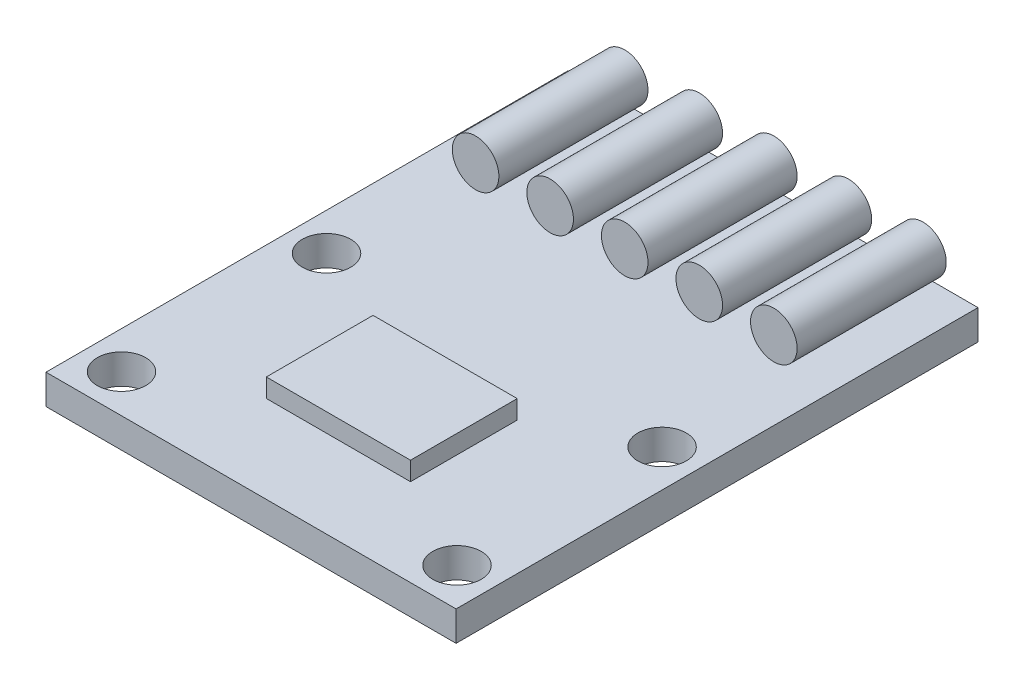
ISO-10303-21;
HEADER;
FILE_DESCRIPTION(('STEP AP214'),'2;1');
FILE_NAME('part.step','',(''),(''),'','','');
FILE_SCHEMA(('AUTOMOTIVE_DESIGN { 1 0 10303 214 1 1 1 1 }'));
ENDSEC;
DATA;
#1=APPLICATION_CONTEXT('core data for automotive mechanical design processes');
#2=APPLICATION_PROTOCOL_DEFINITION('international standard','automotive_design',2000,#1);
#3=PRODUCT_CONTEXT('',#1,'mechanical');
#4=PRODUCT('Part','Part','',(#3));
#5=PRODUCT_RELATED_PRODUCT_CATEGORY('part','',(#4));
#6=PRODUCT_DEFINITION_FORMATION('','',#4);
#7=PRODUCT_DEFINITION_CONTEXT('part definition',#1,'design');
#8=PRODUCT_DEFINITION('design','',#6,#7);
#9=PRODUCT_DEFINITION_SHAPE('','',#8);
#10=(LENGTH_UNIT() NAMED_UNIT(*) SI_UNIT(.MILLI.,.METRE.));
#11=(NAMED_UNIT(*) PLANE_ANGLE_UNIT() SI_UNIT($,.RADIAN.));
#12=(NAMED_UNIT(*) SI_UNIT($,.STERADIAN.) SOLID_ANGLE_UNIT());
#13=UNCERTAINTY_MEASURE_WITH_UNIT(LENGTH_MEASURE(1.E-05),#10,'distance_accuracy_value','');
#14=(GEOMETRIC_REPRESENTATION_CONTEXT(3) GLOBAL_UNCERTAINTY_ASSIGNED_CONTEXT((#13)) GLOBAL_UNIT_ASSIGNED_CONTEXT((#10,
#11,#12)) REPRESENTATION_CONTEXT('',''));
#15=CARTESIAN_POINT('',(0.,0.,0.));
#16=DIRECTION('',(0.,0.,1.));
#17=DIRECTION('',(1.,0.,0.));
#18=AXIS2_PLACEMENT_3D('',#15,#16,#17);
#19=CARTESIAN_POINT('',(8.0467094922053,2.84999999999989,-6.));
#20=DIRECTION('',(0.,0.,-1.));
#21=DIRECTION('',(-1.,0.,0.));
#22=AXIS2_PLACEMENT_3D('',#19,#20,#21);
#23=CYLINDRICAL_SURFACE('',#22,1.25);
#24=CARTESIAN_POINT('',(8.0467094922053,2.84999999999989,-6.));
#25=DIRECTION('',(0.,0.,-1.));
#26=DIRECTION('',(-1.,0.,0.));
#27=AXIS2_PLACEMENT_3D('',#24,#25,#26);
#28=CIRCLE('',#27,1.25);
#29=CARTESIAN_POINT('',(6.7967094922053,2.84999999999989,-6.));
#30=VERTEX_POINT('',#29);
#31=EDGE_CURVE('E11',#30,#30,#28,.T.);
#32=ORIENTED_EDGE('',*,*,#31,.T.);
#33=EDGE_LOOP('',(#32));
#34=FACE_BOUND('',#33,.T.);
#35=CARTESIAN_POINT('',(8.0467094922053,2.84999999999989,-14.));
#36=DIRECTION('',(0.,0.,-1.));
#37=DIRECTION('',(-1.,0.,0.));
#38=AXIS2_PLACEMENT_3D('',#35,#36,#37);
#39=CIRCLE('',#38,1.25);
#40=CARTESIAN_POINT('',(6.7967094922053,2.84999999999989,-14.));
#41=VERTEX_POINT('',#40);
#42=EDGE_CURVE('E45',#41,#41,#39,.T.);
#43=ORIENTED_EDGE('',*,*,#42,.F.);
#44=EDGE_LOOP('',(#43));
#45=FACE_BOUND('',#44,.T.);
#46=ADVANCED_FACE('F42',(#34,#45),#23,.T.);
#47=CARTESIAN_POINT('',(8.0467094922053,2.84999999999989,-6.));
#48=DIRECTION('',(0.,0.,-1.));
#49=DIRECTION('',(-1.,0.,0.));
#50=AXIS2_PLACEMENT_3D('',#47,#48,#49);
#51=PLANE('',#50);
#52=ORIENTED_EDGE('',*,*,#31,.F.);
#53=EDGE_LOOP('',(#52));
#54=FACE_BOUND('',#53,.T.);
#55=ADVANCED_FACE('F57',(#54),#51,.F.);
#56=CARTESIAN_POINT('',(8.0467094922053,2.84999999999989,-14.));
#57=DIRECTION('',(0.,0.,-1.));
#58=DIRECTION('',(-1.,0.,0.));
#59=AXIS2_PLACEMENT_3D('',#56,#57,#58);
#60=PLANE('',#59);
#61=ORIENTED_EDGE('',*,*,#42,.T.);
#62=EDGE_LOOP('',(#61));
#63=FACE_BOUND('',#62,.T.);
#64=ADVANCED_FACE('F54',(#63),#60,.T.);
#65=CLOSED_SHELL('',(#46,#55,#64));
#66=MANIFOLD_SOLID_BREP('B2',#65);
#67=CARTESIAN_POINT('',(4.0467094922053,2.84999999999992,-6.));
#68=DIRECTION('',(0.,0.,-1.));
#69=DIRECTION('',(-1.,0.,0.));
#70=AXIS2_PLACEMENT_3D('',#67,#68,#69);
#71=CYLINDRICAL_SURFACE('',#70,1.25);
#72=CARTESIAN_POINT('',(4.0467094922053,2.84999999999992,-6.));
#73=DIRECTION('',(0.,0.,-1.));
#74=DIRECTION('',(-1.,0.,0.));
#75=AXIS2_PLACEMENT_3D('',#72,#73,#74);
#76=CIRCLE('',#75,1.25);
#77=CARTESIAN_POINT('',(2.7967094922053,2.84999999999992,-6.));
#78=VERTEX_POINT('',#77);
#79=EDGE_CURVE('E41',#78,#78,#76,.T.);
#80=ORIENTED_EDGE('',*,*,#79,.T.);
#81=EDGE_LOOP('',(#80));
#82=FACE_BOUND('',#81,.T.);
#83=CARTESIAN_POINT('',(4.0467094922053,2.84999999999992,-14.));
#84=DIRECTION('',(0.,0.,-1.));
#85=DIRECTION('',(-1.,0.,0.));
#86=AXIS2_PLACEMENT_3D('',#83,#84,#85);
#87=CIRCLE('',#86,1.25);
#88=CARTESIAN_POINT('',(2.7967094922053,2.84999999999992,-14.));
#89=VERTEX_POINT('',#88);
#90=EDGE_CURVE('E94',#89,#89,#87,.T.);
#91=ORIENTED_EDGE('',*,*,#90,.F.);
#92=EDGE_LOOP('',(#91));
#93=FACE_BOUND('',#92,.T.);
#94=ADVANCED_FACE('F91',(#82,#93),#71,.T.);
#95=CARTESIAN_POINT('',(4.0467094922053,2.84999999999992,-6.));
#96=DIRECTION('',(0.,0.,-1.));
#97=DIRECTION('',(-1.,0.,0.));
#98=AXIS2_PLACEMENT_3D('',#95,#96,#97);
#99=PLANE('',#98);
#100=ORIENTED_EDGE('',*,*,#79,.F.);
#101=EDGE_LOOP('',(#100));
#102=FACE_BOUND('',#101,.T.);
#103=ADVANCED_FACE('F106',(#102),#99,.F.);
#104=CARTESIAN_POINT('',(4.0467094922053,2.84999999999992,-14.));
#105=DIRECTION('',(0.,0.,-1.));
#106=DIRECTION('',(-1.,0.,0.));
#107=AXIS2_PLACEMENT_3D('',#104,#105,#106);
#108=PLANE('',#107);
#109=ORIENTED_EDGE('',*,*,#90,.T.);
#110=EDGE_LOOP('',(#109));
#111=FACE_BOUND('',#110,.T.);
#112=ADVANCED_FACE('F103',(#111),#108,.T.);
#113=CLOSED_SHELL('',(#94,#103,#112));
#114=MANIFOLD_SOLID_BREP('B6',#113);
#115=CARTESIAN_POINT('',(0.046709492205298,2.84999999999994,-6.));
#116=DIRECTION('',(0.,0.,-1.));
#117=DIRECTION('',(-1.,0.,0.));
#118=AXIS2_PLACEMENT_3D('',#115,#116,#117);
#119=CYLINDRICAL_SURFACE('',#118,1.25);
#120=CARTESIAN_POINT('',(0.046709492205298,2.84999999999994,-6.));
#121=DIRECTION('',(0.,0.,-1.));
#122=DIRECTION('',(-1.,0.,0.));
#123=AXIS2_PLACEMENT_3D('',#120,#121,#122);
#124=CIRCLE('',#123,1.25);
#125=CARTESIAN_POINT('',(-1.2032905077947,2.84999999999994,-6.));
#126=VERTEX_POINT('',#125);
#127=EDGE_CURVE('E90',#126,#126,#124,.T.);
#128=ORIENTED_EDGE('',*,*,#127,.T.);
#129=EDGE_LOOP('',(#128));
#130=FACE_BOUND('',#129,.T.);
#131=CARTESIAN_POINT('',(0.046709492205298,2.84999999999994,-14.));
#132=DIRECTION('',(0.,0.,-1.));
#133=DIRECTION('',(-1.,0.,0.));
#134=AXIS2_PLACEMENT_3D('',#131,#132,#133);
#135=CIRCLE('',#134,1.25);
#136=CARTESIAN_POINT('',(-1.2032905077947,2.84999999999994,-14.));
#137=VERTEX_POINT('',#136);
#138=EDGE_CURVE('E143',#137,#137,#135,.T.);
#139=ORIENTED_EDGE('',*,*,#138,.F.);
#140=EDGE_LOOP('',(#139));
#141=FACE_BOUND('',#140,.T.);
#142=ADVANCED_FACE('F140',(#130,#141),#119,.T.);
#143=CARTESIAN_POINT('',(0.046709492205298,2.84999999999994,-6.));
#144=DIRECTION('',(0.,0.,-1.));
#145=DIRECTION('',(-1.,0.,0.));
#146=AXIS2_PLACEMENT_3D('',#143,#144,#145);
#147=PLANE('',#146);
#148=ORIENTED_EDGE('',*,*,#127,.F.);
#149=EDGE_LOOP('',(#148));
#150=FACE_BOUND('',#149,.T.);
#151=ADVANCED_FACE('F155',(#150),#147,.F.);
#152=CARTESIAN_POINT('',(0.046709492205298,2.84999999999994,-14.));
#153=DIRECTION('',(0.,0.,-1.));
#154=DIRECTION('',(-1.,0.,0.));
#155=AXIS2_PLACEMENT_3D('',#152,#153,#154);
#156=PLANE('',#155);
#157=ORIENTED_EDGE('',*,*,#138,.T.);
#158=EDGE_LOOP('',(#157));
#159=FACE_BOUND('',#158,.T.);
#160=ADVANCED_FACE('F152',(#159),#156,.T.);
#161=CLOSED_SHELL('',(#142,#151,#160));
#162=MANIFOLD_SOLID_BREP('B36',#161);
#163=CARTESIAN_POINT('',(-3.9532905077947,2.84999999999997,-6.));
#164=DIRECTION('',(0.,0.,-1.));
#165=DIRECTION('',(-1.,0.,0.));
#166=AXIS2_PLACEMENT_3D('',#163,#164,#165);
#167=CYLINDRICAL_SURFACE('',#166,1.25);
#168=CARTESIAN_POINT('',(-3.9532905077947,2.84999999999997,-6.));
#169=DIRECTION('',(0.,0.,-1.));
#170=DIRECTION('',(-1.,0.,0.));
#171=AXIS2_PLACEMENT_3D('',#168,#169,#170);
#172=CIRCLE('',#171,1.25);
#173=CARTESIAN_POINT('',(-5.2032905077947,2.84999999999997,-6.));
#174=VERTEX_POINT('',#173);
#175=EDGE_CURVE('E139',#174,#174,#172,.T.);
#176=ORIENTED_EDGE('',*,*,#175,.T.);
#177=EDGE_LOOP('',(#176));
#178=FACE_BOUND('',#177,.T.);
#179=CARTESIAN_POINT('',(-3.9532905077947,2.84999999999997,-14.));
#180=DIRECTION('',(0.,0.,-1.));
#181=DIRECTION('',(-1.,0.,0.));
#182=AXIS2_PLACEMENT_3D('',#179,#180,#181);
#183=CIRCLE('',#182,1.25);
#184=CARTESIAN_POINT('',(-5.2032905077947,2.84999999999997,-14.));
#185=VERTEX_POINT('',#184);
#186=EDGE_CURVE('E192',#185,#185,#183,.T.);
#187=ORIENTED_EDGE('',*,*,#186,.F.);
#188=EDGE_LOOP('',(#187));
#189=FACE_BOUND('',#188,.T.);
#190=ADVANCED_FACE('F189',(#178,#189),#167,.T.);
#191=CARTESIAN_POINT('',(-3.9532905077947,2.84999999999997,-6.));
#192=DIRECTION('',(0.,0.,-1.));
#193=DIRECTION('',(-1.,0.,0.));
#194=AXIS2_PLACEMENT_3D('',#191,#192,#193);
#195=PLANE('',#194);
#196=ORIENTED_EDGE('',*,*,#175,.F.);
#197=EDGE_LOOP('',(#196));
#198=FACE_BOUND('',#197,.T.);
#199=ADVANCED_FACE('F204',(#198),#195,.F.);
#200=CARTESIAN_POINT('',(-3.9532905077947,2.84999999999997,-14.));
#201=DIRECTION('',(0.,0.,-1.));
#202=DIRECTION('',(-1.,0.,0.));
#203=AXIS2_PLACEMENT_3D('',#200,#201,#202);
#204=PLANE('',#203);
#205=ORIENTED_EDGE('',*,*,#186,.T.);
#206=EDGE_LOOP('',(#205));
#207=FACE_BOUND('',#206,.T.);
#208=ADVANCED_FACE('F201',(#207),#204,.T.);
#209=CLOSED_SHELL('',(#190,#199,#208));
#210=MANIFOLD_SOLID_BREP('B85',#209);
#211=CARTESIAN_POINT('',(-7.9532905077947,2.85,-6.));
#212=DIRECTION('',(0.,0.,-1.));
#213=DIRECTION('',(-1.,0.,0.));
#214=AXIS2_PLACEMENT_3D('',#211,#212,#213);
#215=CYLINDRICAL_SURFACE('',#214,1.25);
#216=CARTESIAN_POINT('',(-7.9532905077947,2.85,-6.));
#217=DIRECTION('',(0.,0.,-1.));
#218=DIRECTION('',(-1.,0.,0.));
#219=AXIS2_PLACEMENT_3D('',#216,#217,#218);
#220=CIRCLE('',#219,1.25);
#221=CARTESIAN_POINT('',(-9.2032905077947,2.85,-6.));
#222=VERTEX_POINT('',#221);
#223=EDGE_CURVE('E188',#222,#222,#220,.T.);
#224=ORIENTED_EDGE('',*,*,#223,.T.);
#225=EDGE_LOOP('',(#224));
#226=FACE_BOUND('',#225,.T.);
#227=CARTESIAN_POINT('',(-7.9532905077947,2.85,-14.));
#228=DIRECTION('',(0.,0.,-1.));
#229=DIRECTION('',(-1.,0.,0.));
#230=AXIS2_PLACEMENT_3D('',#227,#228,#229);
#231=CIRCLE('',#230,1.25);
#232=CARTESIAN_POINT('',(-9.2032905077947,2.85,-14.));
#233=VERTEX_POINT('',#232);
#234=EDGE_CURVE('E242',#233,#233,#231,.T.);
#235=ORIENTED_EDGE('',*,*,#234,.F.);
#236=EDGE_LOOP('',(#235));
#237=FACE_BOUND('',#236,.T.);
#238=ADVANCED_FACE('F239',(#226,#237),#215,.T.);
#239=CARTESIAN_POINT('',(-7.9532905077947,2.85,-6.));
#240=DIRECTION('',(0.,0.,-1.));
#241=DIRECTION('',(-1.,0.,0.));
#242=AXIS2_PLACEMENT_3D('',#239,#240,#241);
#243=PLANE('',#242);
#244=ORIENTED_EDGE('',*,*,#223,.F.);
#245=EDGE_LOOP('',(#244));
#246=FACE_BOUND('',#245,.T.);
#247=ADVANCED_FACE('F254',(#246),#243,.F.);
#248=CARTESIAN_POINT('',(-7.9532905077947,2.85,-14.));
#249=DIRECTION('',(0.,0.,-1.));
#250=DIRECTION('',(-1.,0.,0.));
#251=AXIS2_PLACEMENT_3D('',#248,#249,#250);
#252=PLANE('',#251);
#253=ORIENTED_EDGE('',*,*,#234,.T.);
#254=EDGE_LOOP('',(#253));
#255=FACE_BOUND('',#254,.T.);
#256=ADVANCED_FACE('F251',(#255),#252,.T.);
#257=CLOSED_SHELL('',(#238,#247,#256));
#258=MANIFOLD_SOLID_BREP('B134',#257);
#259=CARTESIAN_POINT('',(0.,1.6,0.));
#260=DIRECTION('',(0.,1.,0.));
#261=DIRECTION('',(0.,0.,1.));
#262=AXIS2_PLACEMENT_3D('',#259,#260,#261);
#263=PLANE('',#262);
#264=CARTESIAN_POINT('',(9.,1.6,0.949999999999998));
#265=DIRECTION('',(0.,1.,0.));
#266=DIRECTION('',(0.,0.,1.));
#267=AXIS2_PLACEMENT_3D('',#264,#265,#266);
#268=CIRCLE('',#267,1.3);
#269=CARTESIAN_POINT('',(9.,1.6,2.25));
#270=VERTEX_POINT('',#269);
#271=EDGE_CURVE('E378',#270,#270,#268,.T.);
#272=ORIENTED_EDGE('',*,*,#271,.F.);
#273=EDGE_LOOP('',(#272));
#274=FACE_BOUND('',#273,.T.);
#275=CARTESIAN_POINT('',(-8.99999999999999,1.6,11.95));
#276=DIRECTION('',(0.,1.,0.));
#277=DIRECTION('',(0.,0.,1.));
#278=AXIS2_PLACEMENT_3D('',#275,#276,#277);
#279=CIRCLE('',#278,1.3);
#280=CARTESIAN_POINT('',(-8.99999999999999,1.6,13.25));
#281=VERTEX_POINT('',#280);
#282=EDGE_CURVE('E394',#281,#281,#279,.T.);
#283=ORIENTED_EDGE('',*,*,#282,.F.);
#284=EDGE_LOOP('',(#283));
#285=FACE_BOUND('',#284,.T.);
#286=CARTESIAN_POINT('',(-9.,1.6,0.949999999999998));
#287=DIRECTION('',(0.,1.,0.));
#288=DIRECTION('',(0.,0.,1.));
#289=AXIS2_PLACEMENT_3D('',#286,#287,#288);
#290=CIRCLE('',#289,1.3);
#291=CARTESIAN_POINT('',(-9.,1.6,2.25));
#292=VERTEX_POINT('',#291);
#293=EDGE_CURVE('E386',#292,#292,#290,.T.);
#294=ORIENTED_EDGE('',*,*,#293,.F.);
#295=EDGE_LOOP('',(#294));
#296=FACE_BOUND('',#295,.T.);
#297=CARTESIAN_POINT('',(9.00000000000001,1.6,11.95));
#298=DIRECTION('',(0.,1.,0.));
#299=DIRECTION('',(0.,0.,1.));
#300=AXIS2_PLACEMENT_3D('',#297,#298,#299);
#301=CIRCLE('',#300,1.3);
#302=CARTESIAN_POINT('',(9.00000000000001,1.6,13.25));
#303=VERTEX_POINT('',#302);
#304=EDGE_CURVE('E393',#303,#303,#301,.T.);
#305=ORIENTED_EDGE('',*,*,#304,.F.);
#306=EDGE_LOOP('',(#305));
#307=FACE_BOUND('',#306,.T.);
#308=DIRECTION('',(0.,0.,-1.));
#309=VECTOR('',#308,1.);
#310=CARTESIAN_POINT('',(11.,1.6,-14.));
#311=LINE('',#310,#309);
#312=CARTESIAN_POINT('',(11.,1.6,14.));
#313=VERTEX_POINT('',#312);
#314=CARTESIAN_POINT('',(11.,1.6,-14.));
#315=VERTEX_POINT('',#314);
#316=EDGE_CURVE('E407',#313,#315,#311,.T.);
#317=ORIENTED_EDGE('',*,*,#316,.T.);
#318=DIRECTION('',(-1.,0.,0.));
#319=VECTOR('',#318,1.);
#320=CARTESIAN_POINT('',(-11.,1.6,-14.));
#321=LINE('',#320,#319);
#322=CARTESIAN_POINT('',(-11.,1.6,-14.));
#323=VERTEX_POINT('',#322);
#324=EDGE_CURVE('E331',#315,#323,#321,.T.);
#325=ORIENTED_EDGE('',*,*,#324,.T.);
#326=DIRECTION('',(0.,0.,1.));
#327=VECTOR('',#326,1.);
#328=CARTESIAN_POINT('',(-11.,1.6,-14.));
#329=LINE('',#328,#327);
#330=CARTESIAN_POINT('',(-11.,1.6,14.));
#331=VERTEX_POINT('',#330);
#332=EDGE_CURVE('E410',#323,#331,#329,.T.);
#333=ORIENTED_EDGE('',*,*,#332,.T.);
#334=DIRECTION('',(1.,0.,0.));
#335=VECTOR('',#334,1.);
#336=CARTESIAN_POINT('',(-11.,1.6,14.));
#337=LINE('',#336,#335);
#338=EDGE_CURVE('E303',#331,#313,#337,.T.);
#339=ORIENTED_EDGE('',*,*,#338,.T.);
#340=EDGE_LOOP('',(#317,#325,#333,#339));
#341=FACE_BOUND('',#340,.T.);
#342=DIRECTION('',(-1.,0.,0.));
#343=VECTOR('',#342,1.);
#344=CARTESIAN_POINT('',(-3.86725316688648,1.6,3.5873612306699));
#345=LINE('',#344,#343);
#346=CARTESIAN_POINT('',(3.8672531668865,1.6,3.5873612306699));
#347=VERTEX_POINT('',#346);
#348=CARTESIAN_POINT('',(-3.86725316688648,1.6,3.5873612306699));
#349=VERTEX_POINT('',#348);
#350=EDGE_CURVE('E577',#347,#349,#345,.T.);
#351=ORIENTED_EDGE('',*,*,#350,.F.);
#352=DIRECTION('',(0.,0.,-1.));
#353=VECTOR('',#352,1.);
#354=CARTESIAN_POINT('',(3.8672531668865,1.6,3.5873612306699));
#355=LINE('',#354,#353);
#356=CARTESIAN_POINT('',(3.8672531668865,1.6,9.3126387693301));
#357=VERTEX_POINT('',#356);
#358=EDGE_CURVE('E376',#357,#347,#355,.T.);
#359=ORIENTED_EDGE('',*,*,#358,.F.);
#360=DIRECTION('',(1.,0.,0.));
#361=VECTOR('',#360,1.);
#362=CARTESIAN_POINT('',(-3.86725316688648,1.6,9.3126387693301));
#363=LINE('',#362,#361);
#364=CARTESIAN_POINT('',(-3.86725316688648,1.6,9.3126387693301));
#365=VERTEX_POINT('',#364);
#366=EDGE_CURVE('E372',#365,#357,#363,.T.);
#367=ORIENTED_EDGE('',*,*,#366,.F.);
#368=DIRECTION('',(0.,0.,1.));
#369=VECTOR('',#368,1.);
#370=CARTESIAN_POINT('',(-3.86725316688648,1.6,3.5873612306699));
#371=LINE('',#370,#369);
#372=EDGE_CURVE('E574',#349,#365,#371,.T.);
#373=ORIENTED_EDGE('',*,*,#372,.F.);
#374=EDGE_LOOP('',(#351,#359,#367,#373));
#375=FACE_BOUND('',#374,.T.);
#376=ADVANCED_FACE('F279',(#274,#285,#296,#307,#341,#375),#263,.T.);
#377=CARTESIAN_POINT('',(11.,1.6,-14.));
#378=DIRECTION('',(-1.,0.,0.));
#379=DIRECTION('',(0.,0.,1.));
#380=AXIS2_PLACEMENT_3D('',#377,#378,#379);
#381=PLANE('',#380);
#382=DIRECTION('',(0.,0.,-1.));
#383=VECTOR('',#382,1.);
#384=CARTESIAN_POINT('',(11.,0.,-14.));
#385=LINE('',#384,#383);
#386=CARTESIAN_POINT('',(11.,0.,14.));
#387=VERTEX_POINT('',#386);
#388=CARTESIAN_POINT('',(11.,0.,-14.));
#389=VERTEX_POINT('',#388);
#390=EDGE_CURVE('E406',#387,#389,#385,.T.);
#391=ORIENTED_EDGE('',*,*,#390,.T.);
#392=DIRECTION('',(0.,-1.,0.));
#393=VECTOR('',#392,1.);
#394=CARTESIAN_POINT('',(11.,1.6,-14.));
#395=LINE('',#394,#393);
#396=EDGE_CURVE('E237',#315,#389,#395,.T.);
#397=ORIENTED_EDGE('',*,*,#396,.F.);
#398=ORIENTED_EDGE('',*,*,#316,.F.);
#399=DIRECTION('',(0.,-1.,0.));
#400=VECTOR('',#399,1.);
#401=CARTESIAN_POINT('',(11.,1.6,14.));
#402=LINE('',#401,#400);
#403=EDGE_CURVE('E413',#313,#387,#402,.T.);
#404=ORIENTED_EDGE('',*,*,#403,.T.);
#405=EDGE_LOOP('',(#391,#397,#398,#404));
#406=FACE_BOUND('',#405,.T.);
#407=ADVANCED_FACE('F281',(#406),#381,.F.);
#408=CARTESIAN_POINT('',(-11.,1.6,-14.));
#409=DIRECTION('',(0.,0.,1.));
#410=DIRECTION('',(1.,0.,0.));
#411=AXIS2_PLACEMENT_3D('',#408,#409,#410);
#412=PLANE('',#411);
#413=DIRECTION('',(-1.,0.,0.));
#414=VECTOR('',#413,1.);
#415=CARTESIAN_POINT('',(-11.,0.,-14.));
#416=LINE('',#415,#414);
#417=CARTESIAN_POINT('',(-11.,0.,-14.));
#418=VERTEX_POINT('',#417);
#419=EDGE_CURVE('E416',#389,#418,#416,.T.);
#420=ORIENTED_EDGE('',*,*,#419,.T.);
#421=DIRECTION('',(0.,-1.,0.));
#422=VECTOR('',#421,1.);
#423=CARTESIAN_POINT('',(-11.,1.6,-14.));
#424=LINE('',#423,#422);
#425=EDGE_CURVE('E287',#323,#418,#424,.T.);
#426=ORIENTED_EDGE('',*,*,#425,.F.);
#427=ORIENTED_EDGE('',*,*,#324,.F.);
#428=ORIENTED_EDGE('',*,*,#396,.T.);
#429=EDGE_LOOP('',(#420,#426,#427,#428));
#430=FACE_BOUND('',#429,.T.);
#431=ADVANCED_FACE('F445',(#430),#412,.F.);
#432=CARTESIAN_POINT('',(-11.,1.6,-14.));
#433=DIRECTION('',(1.,0.,0.));
#434=DIRECTION('',(0.,0.,-1.));
#435=AXIS2_PLACEMENT_3D('',#432,#433,#434);
#436=PLANE('',#435);
#437=DIRECTION('',(0.,0.,1.));
#438=VECTOR('',#437,1.);
#439=CARTESIAN_POINT('',(-11.,0.,-14.));
#440=LINE('',#439,#438);
#441=CARTESIAN_POINT('',(-11.,0.,14.));
#442=VERTEX_POINT('',#441);
#443=EDGE_CURVE('E418',#418,#442,#440,.T.);
#444=ORIENTED_EDGE('',*,*,#443,.T.);
#445=DIRECTION('',(0.,-1.,0.));
#446=VECTOR('',#445,1.);
#447=CARTESIAN_POINT('',(-11.,1.6,14.));
#448=LINE('',#447,#446);
#449=EDGE_CURVE('E422',#331,#442,#448,.T.);
#450=ORIENTED_EDGE('',*,*,#449,.F.);
#451=ORIENTED_EDGE('',*,*,#332,.F.);
#452=ORIENTED_EDGE('',*,*,#425,.T.);
#453=EDGE_LOOP('',(#444,#450,#451,#452));
#454=FACE_BOUND('',#453,.T.);
#455=ADVANCED_FACE('F427',(#454),#436,.F.);
#456=CARTESIAN_POINT('',(-11.,1.6,14.));
#457=DIRECTION('',(0.,0.,-1.));
#458=DIRECTION('',(-1.,0.,0.));
#459=AXIS2_PLACEMENT_3D('',#456,#457,#458);
#460=PLANE('',#459);
#461=DIRECTION('',(1.,0.,0.));
#462=VECTOR('',#461,1.);
#463=CARTESIAN_POINT('',(-11.,0.,14.));
#464=LINE('',#463,#462);
#465=EDGE_CURVE('E324',#442,#387,#464,.T.);
#466=ORIENTED_EDGE('',*,*,#465,.T.);
#467=ORIENTED_EDGE('',*,*,#403,.F.);
#468=ORIENTED_EDGE('',*,*,#338,.F.);
#469=ORIENTED_EDGE('',*,*,#449,.T.);
#470=EDGE_LOOP('',(#466,#467,#468,#469));
#471=FACE_BOUND('',#470,.T.);
#472=ADVANCED_FACE('F435',(#471),#460,.F.);
#473=CARTESIAN_POINT('',(0.,0.,0.));
#474=DIRECTION('',(0.,1.,0.));
#475=DIRECTION('',(0.,0.,1.));
#476=AXIS2_PLACEMENT_3D('',#473,#474,#475);
#477=PLANE('',#476);
#478=CARTESIAN_POINT('',(9.,0.,0.949999999999998));
#479=DIRECTION('',(0.,1.,0.));
#480=DIRECTION('',(0.,0.,1.));
#481=AXIS2_PLACEMENT_3D('',#478,#479,#480);
#482=CIRCLE('',#481,1.3);
#483=CARTESIAN_POINT('',(9.,0.,2.25));
#484=VERTEX_POINT('',#483);
#485=EDGE_CURVE('E381',#484,#484,#482,.F.);
#486=ORIENTED_EDGE('',*,*,#485,.F.);
#487=EDGE_LOOP('',(#486));
#488=FACE_BOUND('',#487,.T.);
#489=CARTESIAN_POINT('',(-8.99999999999999,0.,11.95));
#490=DIRECTION('',(0.,1.,0.));
#491=DIRECTION('',(0.,0.,1.));
#492=AXIS2_PLACEMENT_3D('',#489,#490,#491);
#493=CIRCLE('',#492,1.3);
#494=CARTESIAN_POINT('',(-8.99999999999999,0.,13.25));
#495=VERTEX_POINT('',#494);
#496=EDGE_CURVE('E390',#495,#495,#493,.F.);
#497=ORIENTED_EDGE('',*,*,#496,.F.);
#498=EDGE_LOOP('',(#497));
#499=FACE_BOUND('',#498,.T.);
#500=CARTESIAN_POINT('',(-9.,0.,0.949999999999998));
#501=DIRECTION('',(0.,1.,0.));
#502=DIRECTION('',(0.,0.,1.));
#503=AXIS2_PLACEMENT_3D('',#500,#501,#502);
#504=CIRCLE('',#503,1.3);
#505=CARTESIAN_POINT('',(-9.,0.,2.25));
#506=VERTEX_POINT('',#505);
#507=EDGE_CURVE('E389',#506,#506,#504,.F.);
#508=ORIENTED_EDGE('',*,*,#507,.F.);
#509=EDGE_LOOP('',(#508));
#510=FACE_BOUND('',#509,.T.);
#511=CARTESIAN_POINT('',(9.00000000000001,0.,11.95));
#512=DIRECTION('',(0.,1.,0.));
#513=DIRECTION('',(0.,0.,1.));
#514=AXIS2_PLACEMENT_3D('',#511,#512,#513);
#515=CIRCLE('',#514,1.3);
#516=CARTESIAN_POINT('',(9.00000000000001,0.,13.25));
#517=VERTEX_POINT('',#516);
#518=EDGE_CURVE('E403',#517,#517,#515,.F.);
#519=ORIENTED_EDGE('',*,*,#518,.F.);
#520=EDGE_LOOP('',(#519));
#521=FACE_BOUND('',#520,.T.);
#522=ORIENTED_EDGE('',*,*,#390,.F.);
#523=ORIENTED_EDGE('',*,*,#465,.F.);
#524=ORIENTED_EDGE('',*,*,#443,.F.);
#525=ORIENTED_EDGE('',*,*,#419,.F.);
#526=EDGE_LOOP('',(#522,#523,#524,#525));
#527=FACE_BOUND('',#526,.T.);
#528=ADVANCED_FACE('F431',(#488,#499,#510,#521,#527),#477,.F.);
#529=CARTESIAN_POINT('',(9.00000000000001,-3.67695526217005,11.95));
#530=DIRECTION('',(0.,1.,0.));
#531=DIRECTION('',(0.,0.,1.));
#532=AXIS2_PLACEMENT_3D('',#529,#530,#531);
#533=CYLINDRICAL_SURFACE('',#532,1.3);
#534=ORIENTED_EDGE('',*,*,#518,.T.);
#535=EDGE_LOOP('',(#534));
#536=FACE_BOUND('',#535,.T.);
#537=ORIENTED_EDGE('',*,*,#304,.T.);
#538=EDGE_LOOP('',(#537));
#539=FACE_BOUND('',#538,.T.);
#540=ADVANCED_FACE('F442',(#536,#539),#533,.F.);
#541=CARTESIAN_POINT('',(-9.,-3.67695526217005,0.949999999999998));
#542=DIRECTION('',(0.,1.,0.));
#543=DIRECTION('',(0.,0.,1.));
#544=AXIS2_PLACEMENT_3D('',#541,#542,#543);
#545=CYLINDRICAL_SURFACE('',#544,1.3);
#546=ORIENTED_EDGE('',*,*,#507,.T.);
#547=EDGE_LOOP('',(#546));
#548=FACE_BOUND('',#547,.T.);
#549=ORIENTED_EDGE('',*,*,#293,.T.);
#550=EDGE_LOOP('',(#549));
#551=FACE_BOUND('',#550,.T.);
#552=ADVANCED_FACE('F458',(#548,#551),#545,.F.);
#553=CARTESIAN_POINT('',(-8.99999999999999,-3.67695526217005,11.95));
#554=DIRECTION('',(0.,1.,0.));
#555=DIRECTION('',(0.,0.,1.));
#556=AXIS2_PLACEMENT_3D('',#553,#554,#555);
#557=CYLINDRICAL_SURFACE('',#556,1.3);
#558=ORIENTED_EDGE('',*,*,#496,.T.);
#559=EDGE_LOOP('',(#558));
#560=FACE_BOUND('',#559,.T.);
#561=ORIENTED_EDGE('',*,*,#282,.T.);
#562=EDGE_LOOP('',(#561));
#563=FACE_BOUND('',#562,.T.);
#564=ADVANCED_FACE('F463',(#560,#563),#557,.F.);
#565=CARTESIAN_POINT('',(9.,-3.67695526217005,0.949999999999998));
#566=DIRECTION('',(0.,1.,0.));
#567=DIRECTION('',(0.,0.,1.));
#568=AXIS2_PLACEMENT_3D('',#565,#566,#567);
#569=CYLINDRICAL_SURFACE('',#568,1.3);
#570=ORIENTED_EDGE('',*,*,#485,.T.);
#571=EDGE_LOOP('',(#570));
#572=FACE_BOUND('',#571,.T.);
#573=ORIENTED_EDGE('',*,*,#271,.T.);
#574=EDGE_LOOP('',(#573));
#575=FACE_BOUND('',#574,.T.);
#576=ADVANCED_FACE('F460',(#572,#575),#569,.F.);
#577=CARTESIAN_POINT('',(3.8672531668865,2.6,3.5873612306699));
#578=DIRECTION('',(-1.,0.,0.));
#579=DIRECTION('',(0.,0.,1.));
#580=AXIS2_PLACEMENT_3D('',#577,#578,#579);
#581=PLANE('',#580);
#582=ORIENTED_EDGE('',*,*,#358,.T.);
#583=DIRECTION('',(0.,-1.,0.));
#584=VECTOR('',#583,1.);
#585=CARTESIAN_POINT('',(3.8672531668865,2.6,3.5873612306699));
#586=LINE('',#585,#584);
#587=CARTESIAN_POINT('',(3.8672531668865,2.6,3.5873612306699));
#588=VERTEX_POINT('',#587);
#589=EDGE_CURVE('E357',#588,#347,#586,.T.);
#590=ORIENTED_EDGE('',*,*,#589,.F.);
#591=DIRECTION('',(0.,0.,-1.));
#592=VECTOR('',#591,1.);
#593=CARTESIAN_POINT('',(3.8672531668865,2.6,3.5873612306699));
#594=LINE('',#593,#592);
#595=CARTESIAN_POINT('',(3.8672531668865,2.6,9.3126387693301));
#596=VERTEX_POINT('',#595);
#597=EDGE_CURVE('E364',#596,#588,#594,.T.);
#598=ORIENTED_EDGE('',*,*,#597,.F.);
#599=DIRECTION('',(0.,-1.,0.));
#600=VECTOR('',#599,1.);
#601=CARTESIAN_POINT('',(3.8672531668865,2.6,9.3126387693301));
#602=LINE('',#601,#600);
#603=EDGE_CURVE('E571',#596,#357,#602,.T.);
#604=ORIENTED_EDGE('',*,*,#603,.T.);
#605=EDGE_LOOP('',(#582,#590,#598,#604));
#606=FACE_BOUND('',#605,.T.);
#607=ADVANCED_FACE('F374',(#606),#581,.F.);
#608=CARTESIAN_POINT('',(-3.86725316688648,2.6,3.5873612306699));
#609=DIRECTION('',(0.,0.,1.));
#610=DIRECTION('',(1.,0.,0.));
#611=AXIS2_PLACEMENT_3D('',#608,#609,#610);
#612=PLANE('',#611);
#613=ORIENTED_EDGE('',*,*,#350,.T.);
#614=DIRECTION('',(0.,-1.,0.));
#615=VECTOR('',#614,1.);
#616=CARTESIAN_POINT('',(-3.86725316688648,2.6,3.5873612306699));
#617=LINE('',#616,#615);
#618=CARTESIAN_POINT('',(-3.86725316688648,2.6,3.5873612306699));
#619=VERTEX_POINT('',#618);
#620=EDGE_CURVE('E360',#619,#349,#617,.T.);
#621=ORIENTED_EDGE('',*,*,#620,.F.);
#622=DIRECTION('',(-1.,0.,0.));
#623=VECTOR('',#622,1.);
#624=CARTESIAN_POINT('',(-3.86725316688648,2.6,3.5873612306699));
#625=LINE('',#624,#623);
#626=EDGE_CURVE('E353',#588,#619,#625,.T.);
#627=ORIENTED_EDGE('',*,*,#626,.F.);
#628=ORIENTED_EDGE('',*,*,#589,.T.);
#629=EDGE_LOOP('',(#613,#621,#627,#628));
#630=FACE_BOUND('',#629,.T.);
#631=ADVANCED_FACE('F355',(#630),#612,.F.);
#632=CARTESIAN_POINT('',(-3.86725316688648,2.6,3.5873612306699));
#633=DIRECTION('',(1.,0.,0.));
#634=DIRECTION('',(0.,0.,-1.));
#635=AXIS2_PLACEMENT_3D('',#632,#633,#634);
#636=PLANE('',#635);
#637=ORIENTED_EDGE('',*,*,#372,.T.);
#638=DIRECTION('',(0.,-1.,0.));
#639=VECTOR('',#638,1.);
#640=CARTESIAN_POINT('',(-3.86725316688648,2.6,9.3126387693301));
#641=LINE('',#640,#639);
#642=CARTESIAN_POINT('',(-3.86725316688648,2.6,9.3126387693301));
#643=VERTEX_POINT('',#642);
#644=EDGE_CURVE('E294',#643,#365,#641,.T.);
#645=ORIENTED_EDGE('',*,*,#644,.F.);
#646=DIRECTION('',(0.,0.,1.));
#647=VECTOR('',#646,1.);
#648=CARTESIAN_POINT('',(-3.86725316688648,2.6,3.5873612306699));
#649=LINE('',#648,#647);
#650=EDGE_CURVE('E363',#619,#643,#649,.T.);
#651=ORIENTED_EDGE('',*,*,#650,.F.);
#652=ORIENTED_EDGE('',*,*,#620,.T.);
#653=EDGE_LOOP('',(#637,#645,#651,#652));
#654=FACE_BOUND('',#653,.T.);
#655=ADVANCED_FACE('F475',(#654),#636,.F.);
#656=CARTESIAN_POINT('',(-3.86725316688648,2.6,9.3126387693301));
#657=DIRECTION('',(0.,0.,-1.));
#658=DIRECTION('',(-1.,0.,0.));
#659=AXIS2_PLACEMENT_3D('',#656,#657,#658);
#660=PLANE('',#659);
#661=ORIENTED_EDGE('',*,*,#366,.T.);
#662=ORIENTED_EDGE('',*,*,#603,.F.);
#663=DIRECTION('',(1.,0.,0.));
#664=VECTOR('',#663,1.);
#665=CARTESIAN_POINT('',(-3.86725316688648,2.6,9.3126387693301));
#666=LINE('',#665,#664);
#667=EDGE_CURVE('E368',#643,#596,#666,.T.);
#668=ORIENTED_EDGE('',*,*,#667,.F.);
#669=ORIENTED_EDGE('',*,*,#644,.T.);
#670=EDGE_LOOP('',(#661,#662,#668,#669));
#671=FACE_BOUND('',#670,.T.);
#672=ADVANCED_FACE('F478',(#671),#660,.F.);
#673=CARTESIAN_POINT('',(0.,2.6,0.));
#674=DIRECTION('',(0.,1.,0.));
#675=DIRECTION('',(0.,0.,1.));
#676=AXIS2_PLACEMENT_3D('',#673,#674,#675);
#677=PLANE('',#676);
#678=ORIENTED_EDGE('',*,*,#597,.T.);
#679=ORIENTED_EDGE('',*,*,#626,.T.);
#680=ORIENTED_EDGE('',*,*,#650,.T.);
#681=ORIENTED_EDGE('',*,*,#667,.T.);
#682=EDGE_LOOP('',(#678,#679,#680,#681));
#683=FACE_BOUND('',#682,.T.);
#684=ADVANCED_FACE('F367',(#683),#677,.T.);
#685=CLOSED_SHELL('',(#376,#407,#431,#455,#472,#528,#540,#552,#564,#576,#607,#631,#655,#672,#684));
#686=MANIFOLD_SOLID_BREP('B183',#685);
#687=ADVANCED_BREP_SHAPE_REPRESENTATION('',(#18,#66,#114,#162,#210,#258,#686),#14);
#688=SHAPE_DEFINITION_REPRESENTATION(#9,#687);
ENDSEC;
END-ISO-10303-21;
